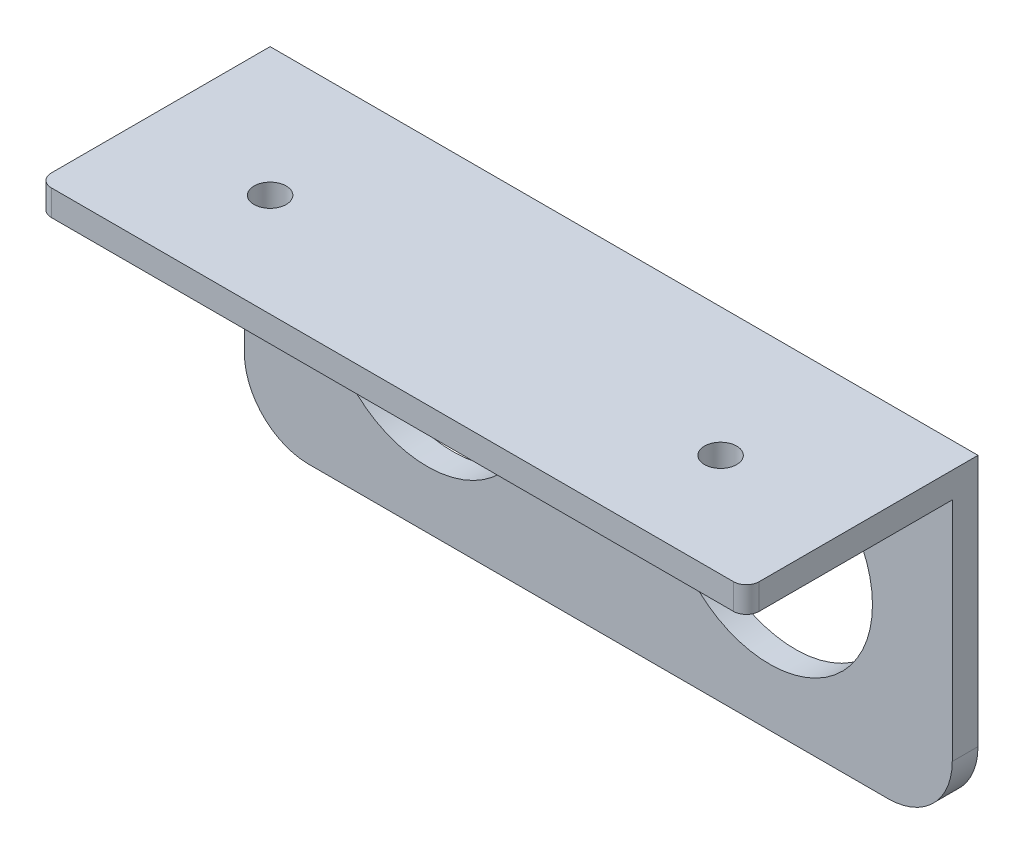
ISO-10303-21;
HEADER;
FILE_DESCRIPTION(('STEP AP214'),'2;1');
FILE_NAME('part.step','',(''),(''),'','','');
FILE_SCHEMA(('AUTOMOTIVE_DESIGN { 1 0 10303 214 1 1 1 1 }'));
ENDSEC;
DATA;
#1=APPLICATION_CONTEXT('core data for automotive mechanical design processes');
#2=APPLICATION_PROTOCOL_DEFINITION('international standard','automotive_design',2000,#1);
#3=PRODUCT_CONTEXT('',#1,'mechanical');
#4=PRODUCT('Part','Part','',(#3));
#5=PRODUCT_RELATED_PRODUCT_CATEGORY('part','',(#4));
#6=PRODUCT_DEFINITION_FORMATION('','',#4);
#7=PRODUCT_DEFINITION_CONTEXT('part definition',#1,'design');
#8=PRODUCT_DEFINITION('design','',#6,#7);
#9=PRODUCT_DEFINITION_SHAPE('','',#8);
#10=(LENGTH_UNIT() NAMED_UNIT(*) SI_UNIT(.MILLI.,.METRE.));
#11=(NAMED_UNIT(*) PLANE_ANGLE_UNIT() SI_UNIT($,.RADIAN.));
#12=(NAMED_UNIT(*) SI_UNIT($,.STERADIAN.) SOLID_ANGLE_UNIT());
#13=UNCERTAINTY_MEASURE_WITH_UNIT(LENGTH_MEASURE(1.E-05),#10,'distance_accuracy_value','');
#14=(GEOMETRIC_REPRESENTATION_CONTEXT(3) GLOBAL_UNCERTAINTY_ASSIGNED_CONTEXT((#13)) GLOBAL_UNIT_ASSIGNED_CONTEXT((#10,
#11,#12)) REPRESENTATION_CONTEXT('',''));
#15=CARTESIAN_POINT('',(0.,0.,0.));
#16=DIRECTION('',(0.,0.,1.));
#17=DIRECTION('',(1.,0.,0.));
#18=AXIS2_PLACEMENT_3D('',#15,#16,#17);
#19=CARTESIAN_POINT('',(21.4280575539568,6.06816546762589,2.));
#20=DIRECTION('',(0.,0.,-1.));
#21=DIRECTION('',(-1.,0.,0.));
#22=AXIS2_PLACEMENT_3D('',#19,#20,#21);
#23=CYLINDRICAL_SURFACE('',#22,5.);
#24=DIRECTION('',(0.,0.,1.));
#25=VECTOR('',#24,1.);
#26=CARTESIAN_POINT('',(21.4280575539568,1.06816546762589,2.));
#27=LINE('',#26,#25);
#28=CARTESIAN_POINT('',(21.4280575539568,1.06816546762589,0.));
#29=VERTEX_POINT('',#28);
#30=CARTESIAN_POINT('',(21.4280575539568,1.06816546762589,2.));
#31=VERTEX_POINT('',#30);
#32=EDGE_CURVE('E295',#29,#31,#27,.T.);
#33=ORIENTED_EDGE('',*,*,#32,.F.);
#34=CARTESIAN_POINT('',(21.4280575539568,6.06816546762589,0.));
#35=DIRECTION('',(0.,0.,1.));
#36=DIRECTION('',(1.,0.,0.));
#37=AXIS2_PLACEMENT_3D('',#34,#35,#36);
#38=CIRCLE('',#37,5.);
#39=CARTESIAN_POINT('',(26.4280575539568,6.06816546762589,0.));
#40=VERTEX_POINT('',#39);
#41=EDGE_CURVE('E301',#40,#29,#38,.F.);
#42=ORIENTED_EDGE('',*,*,#41,.F.);
#43=DIRECTION('',(0.,0.,1.));
#44=VECTOR('',#43,1.);
#45=CARTESIAN_POINT('',(26.4280575539568,6.06816546762589,2.));
#46=LINE('',#45,#44);
#47=CARTESIAN_POINT('',(26.4280575539568,6.06816546762589,2.));
#48=VERTEX_POINT('',#47);
#49=EDGE_CURVE('E185',#48,#40,#46,.F.);
#50=ORIENTED_EDGE('',*,*,#49,.F.);
#51=CARTESIAN_POINT('',(21.4280575539568,6.06816546762589,2.));
#52=DIRECTION('',(0.,0.,1.));
#53=DIRECTION('',(1.,0.,0.));
#54=AXIS2_PLACEMENT_3D('',#51,#52,#53);
#55=CIRCLE('',#54,5.);
#56=EDGE_CURVE('E304',#31,#48,#55,.T.);
#57=ORIENTED_EDGE('',*,*,#56,.F.);
#58=EDGE_LOOP('',(#33,#42,#50,#57));
#59=FACE_BOUND('',#58,.T.);
#60=ADVANCED_FACE('F51',(#59),#23,.T.);
#61=CARTESIAN_POINT('',(-23.5719424460432,6.06816546762589,2.));
#62=DIRECTION('',(0.,0.,-1.));
#63=DIRECTION('',(-1.,0.,0.));
#64=AXIS2_PLACEMENT_3D('',#61,#62,#63);
#65=CYLINDRICAL_SURFACE('',#64,5.);
#66=DIRECTION('',(0.,0.,-1.));
#67=VECTOR('',#66,1.);
#68=CARTESIAN_POINT('',(-23.5719424460432,1.06816546762589,2.));
#69=LINE('',#68,#67);
#70=CARTESIAN_POINT('',(-23.5719424460432,1.06816546762589,2.));
#71=VERTEX_POINT('',#70);
#72=CARTESIAN_POINT('',(-23.5719424460432,1.06816546762589,0.));
#73=VERTEX_POINT('',#72);
#74=EDGE_CURVE('E276',#71,#73,#69,.T.);
#75=ORIENTED_EDGE('',*,*,#74,.F.);
#76=CARTESIAN_POINT('',(-23.5719424460432,6.06816546762589,2.));
#77=DIRECTION('',(0.,0.,1.));
#78=DIRECTION('',(1.,0.,0.));
#79=AXIS2_PLACEMENT_3D('',#76,#77,#78);
#80=CIRCLE('',#79,5.);
#81=CARTESIAN_POINT('',(-28.5719424460432,6.06816546762589,2.));
#82=VERTEX_POINT('',#81);
#83=EDGE_CURVE('E289',#82,#71,#80,.T.);
#84=ORIENTED_EDGE('',*,*,#83,.F.);
#85=DIRECTION('',(0.,0.,-1.));
#86=VECTOR('',#85,1.);
#87=CARTESIAN_POINT('',(-28.5719424460432,6.06816546762589,2.));
#88=LINE('',#87,#86);
#89=CARTESIAN_POINT('',(-28.5719424460432,6.06816546762589,0.));
#90=VERTEX_POINT('',#89);
#91=EDGE_CURVE('E285',#90,#82,#88,.F.);
#92=ORIENTED_EDGE('',*,*,#91,.F.);
#93=CARTESIAN_POINT('',(-23.5719424460432,6.06816546762589,0.));
#94=DIRECTION('',(0.,0.,1.));
#95=DIRECTION('',(1.,0.,0.));
#96=AXIS2_PLACEMENT_3D('',#93,#94,#95);
#97=CIRCLE('',#96,5.);
#98=EDGE_CURVE('E292',#73,#90,#97,.F.);
#99=ORIENTED_EDGE('',*,*,#98,.F.);
#100=EDGE_LOOP('',(#75,#84,#92,#99));
#101=FACE_BOUND('',#100,.T.);
#102=ADVANCED_FACE('F398',(#101),#65,.T.);
#103=CARTESIAN_POINT('',(-28.5719424460432,23.6681654676259,2.));
#104=DIRECTION('',(1.,0.,0.));
#105=DIRECTION('',(0.,1.,0.));
#106=AXIS2_PLACEMENT_3D('',#103,#104,#105);
#107=PLANE('',#106);
#108=DIRECTION('',(0.,0.,-1.));
#109=VECTOR('',#108,1.);
#110=CARTESIAN_POINT('',(-28.5719424460432,23.6681654676259,18.));
#111=LINE('',#110,#109);
#112=CARTESIAN_POINT('',(-28.5719424460432,23.6681654676259,17.));
#113=VERTEX_POINT('',#112);
#114=CARTESIAN_POINT('',(-28.5719424460432,23.6681654676259,2.));
#115=VERTEX_POINT('',#114);
#116=EDGE_CURVE('E213',#113,#115,#111,.T.);
#117=ORIENTED_EDGE('',*,*,#116,.F.);
#118=DIRECTION('',(0.,-1.,0.));
#119=VECTOR('',#118,1.);
#120=CARTESIAN_POINT('',(-28.5719424460432,25.6681654676259,17.));
#121=LINE('',#120,#119);
#122=CARTESIAN_POINT('',(-28.5719424460432,25.6681654676259,17.));
#123=VERTEX_POINT('',#122);
#124=EDGE_CURVE('E11',#113,#123,#121,.F.);
#125=ORIENTED_EDGE('',*,*,#124,.T.);
#126=DIRECTION('',(0.,0.,-1.));
#127=VECTOR('',#126,1.);
#128=CARTESIAN_POINT('',(-28.5719424460432,25.6681654676259,18.));
#129=LINE('',#128,#127);
#130=CARTESIAN_POINT('',(-28.5719424460432,25.6681654676259,0.));
#131=VERTEX_POINT('',#130);
#132=EDGE_CURVE('E177',#123,#131,#129,.T.);
#133=ORIENTED_EDGE('',*,*,#132,.T.);
#134=DIRECTION('',(0.,-1.,0.));
#135=VECTOR('',#134,1.);
#136=CARTESIAN_POINT('',(-28.5719424460432,23.6681654676259,0.));
#137=LINE('',#136,#135);
#138=EDGE_CURVE('E195',#131,#90,#137,.T.);
#139=ORIENTED_EDGE('',*,*,#138,.T.);
#140=ORIENTED_EDGE('',*,*,#91,.T.);
#141=DIRECTION('',(0.,-1.,0.));
#142=VECTOR('',#141,1.);
#143=CARTESIAN_POINT('',(-28.5719424460432,23.6681654676259,2.));
#144=LINE('',#143,#142);
#145=EDGE_CURVE('E188',#115,#82,#144,.T.);
#146=ORIENTED_EDGE('',*,*,#145,.F.);
#147=EDGE_LOOP('',(#117,#125,#133,#139,#140,#146));
#148=FACE_BOUND('',#147,.T.);
#149=ADVANCED_FACE('F400',(#148),#107,.F.);
#150=CARTESIAN_POINT('',(-28.5719424460432,1.06816546762589,2.));
#151=DIRECTION('',(0.,1.,0.));
#152=DIRECTION('',(0.,0.,1.));
#153=AXIS2_PLACEMENT_3D('',#150,#151,#152);
#154=PLANE('',#153);
#155=DIRECTION('',(1.,0.,0.));
#156=VECTOR('',#155,1.);
#157=CARTESIAN_POINT('',(-28.5719424460432,1.06816546762589,0.));
#158=LINE('',#157,#156);
#159=EDGE_CURVE('E189',#73,#29,#158,.T.);
#160=ORIENTED_EDGE('',*,*,#159,.T.);
#161=ORIENTED_EDGE('',*,*,#32,.T.);
#162=DIRECTION('',(1.,0.,0.));
#163=VECTOR('',#162,1.);
#164=CARTESIAN_POINT('',(-28.5719424460432,1.06816546762589,2.));
#165=LINE('',#164,#163);
#166=EDGE_CURVE('E265',#71,#31,#165,.T.);
#167=ORIENTED_EDGE('',*,*,#166,.F.);
#168=ORIENTED_EDGE('',*,*,#74,.T.);
#169=EDGE_LOOP('',(#160,#161,#167,#168));
#170=FACE_BOUND('',#169,.T.);
#171=ADVANCED_FACE('F395',(#170),#154,.F.);
#172=CARTESIAN_POINT('',(26.4280575539568,23.6681654676259,2.));
#173=DIRECTION('',(1.,0.,0.));
#174=DIRECTION('',(0.,1.,0.));
#175=AXIS2_PLACEMENT_3D('',#172,#173,#174);
#176=PLANE('',#175);
#177=DIRECTION('',(0.,0.,-1.));
#178=VECTOR('',#177,1.);
#179=CARTESIAN_POINT('',(26.4280575539568,25.6681654676259,18.));
#180=LINE('',#179,#178);
#181=CARTESIAN_POINT('',(26.4280575539568,25.6681654676259,17.));
#182=VERTEX_POINT('',#181);
#183=CARTESIAN_POINT('',(26.4280575539568,25.6681654676259,0.));
#184=VERTEX_POINT('',#183);
#185=EDGE_CURVE('E166',#182,#184,#180,.T.);
#186=ORIENTED_EDGE('',*,*,#185,.F.);
#187=DIRECTION('',(0.,-1.,0.));
#188=VECTOR('',#187,1.);
#189=CARTESIAN_POINT('',(26.4280575539568,23.6681654676259,17.));
#190=LINE('',#189,#188);
#191=CARTESIAN_POINT('',(26.4280575539568,23.6681654676259,17.));
#192=VERTEX_POINT('',#191);
#193=EDGE_CURVE('E335',#182,#192,#190,.T.);
#194=ORIENTED_EDGE('',*,*,#193,.T.);
#195=DIRECTION('',(0.,0.,-1.));
#196=VECTOR('',#195,1.);
#197=CARTESIAN_POINT('',(26.4280575539568,23.6681654676259,18.));
#198=LINE('',#197,#196);
#199=CARTESIAN_POINT('',(26.4280575539568,23.6681654676259,2.));
#200=VERTEX_POINT('',#199);
#201=EDGE_CURVE('E176',#192,#200,#198,.T.);
#202=ORIENTED_EDGE('',*,*,#201,.T.);
#203=DIRECTION('',(0.,-1.,0.));
#204=VECTOR('',#203,1.);
#205=CARTESIAN_POINT('',(26.4280575539568,23.6681654676259,2.));
#206=LINE('',#205,#204);
#207=EDGE_CURVE('E269',#200,#48,#206,.T.);
#208=ORIENTED_EDGE('',*,*,#207,.T.);
#209=ORIENTED_EDGE('',*,*,#49,.T.);
#210=DIRECTION('',(0.,-1.,0.));
#211=VECTOR('',#210,1.);
#212=CARTESIAN_POINT('',(26.4280575539568,23.6681654676259,0.));
#213=LINE('',#212,#211);
#214=EDGE_CURVE('E181',#184,#40,#213,.T.);
#215=ORIENTED_EDGE('',*,*,#214,.F.);
#216=EDGE_LOOP('',(#186,#194,#202,#208,#209,#215));
#217=FACE_BOUND('',#216,.T.);
#218=ADVANCED_FACE('F182',(#217),#176,.T.);
#219=CARTESIAN_POINT('',(0.,0.,2.));
#220=DIRECTION('',(0.,0.,1.));
#221=DIRECTION('',(1.,0.,0.));
#222=AXIS2_PLACEMENT_3D('',#219,#220,#221);
#223=PLANE('',#222);
#224=ORIENTED_EDGE('',*,*,#166,.T.);
#225=ORIENTED_EDGE('',*,*,#56,.T.);
#226=ORIENTED_EDGE('',*,*,#207,.F.);
#227=DIRECTION('',(1.,0.,0.));
#228=VECTOR('',#227,1.);
#229=CARTESIAN_POINT('',(-28.5719424460432,23.6681654676259,2.));
#230=LINE('',#229,#228);
#231=CARTESIAN_POINT('',(3.82805755395682,23.6681654676259,2.));
#232=VERTEX_POINT('',#231);
#233=EDGE_CURVE('E272',#232,#200,#230,.T.);
#234=ORIENTED_EDGE('',*,*,#233,.F.);
#235=DIRECTION('',(0.,-1.,0.));
#236=VECTOR('',#235,1.);
#237=CARTESIAN_POINT('',(3.82805755395682,23.6681654676259,2.));
#238=LINE('',#237,#236);
#239=CARTESIAN_POINT('',(3.82805755395682,20.7681654676259,2.));
#240=VERTEX_POINT('',#239);
#241=EDGE_CURVE('E222',#232,#240,#238,.T.);
#242=ORIENTED_EDGE('',*,*,#241,.T.);
#243=CARTESIAN_POINT('',(2.02805755395682,20.7681654676259,2.));
#244=DIRECTION('',(0.,0.,1.));
#245=DIRECTION('',(1.,0.,0.));
#246=AXIS2_PLACEMENT_3D('',#243,#244,#245);
#247=CIRCLE('',#246,1.8);
#248=CARTESIAN_POINT('',(2.02805755395682,18.9681654676259,2.));
#249=VERTEX_POINT('',#248);
#250=EDGE_CURVE('E315',#240,#249,#247,.F.);
#251=ORIENTED_EDGE('',*,*,#250,.T.);
#252=DIRECTION('',(1.,0.,0.));
#253=VECTOR('',#252,1.);
#254=CARTESIAN_POINT('',(-6.17194244604318,18.9681654676259,2.));
#255=LINE('',#254,#253);
#256=CARTESIAN_POINT('',(-4.37194244604318,18.9681654676259,2.));
#257=VERTEX_POINT('',#256);
#258=EDGE_CURVE('E233',#257,#249,#255,.T.);
#259=ORIENTED_EDGE('',*,*,#258,.F.);
#260=CARTESIAN_POINT('',(-4.37194244604318,20.7681654676259,2.));
#261=DIRECTION('',(0.,0.,1.));
#262=DIRECTION('',(1.,0.,0.));
#263=AXIS2_PLACEMENT_3D('',#260,#261,#262);
#264=CIRCLE('',#263,1.8);
#265=CARTESIAN_POINT('',(-6.17194244604318,20.7681654676259,2.));
#266=VERTEX_POINT('',#265);
#267=EDGE_CURVE('E329',#257,#266,#264,.F.);
#268=ORIENTED_EDGE('',*,*,#267,.T.);
#269=DIRECTION('',(0.,-1.,0.));
#270=VECTOR('',#269,1.);
#271=CARTESIAN_POINT('',(-6.17194244604318,23.6681654676259,2.));
#272=LINE('',#271,#270);
#273=CARTESIAN_POINT('',(-6.17194244604318,23.6681654676259,2.));
#274=VERTEX_POINT('',#273);
#275=EDGE_CURVE('E216',#274,#266,#272,.T.);
#276=ORIENTED_EDGE('',*,*,#275,.F.);
#277=EDGE_CURVE('E273',#115,#274,#230,.T.);
#278=ORIENTED_EDGE('',*,*,#277,.F.);
#279=ORIENTED_EDGE('',*,*,#145,.T.);
#280=ORIENTED_EDGE('',*,*,#83,.T.);
#281=EDGE_LOOP('',(#224,#225,#226,#234,#242,#251,#259,#268,#276,#278,#279,#280));
#282=FACE_BOUND('',#281,.T.);
#283=CARTESIAN_POINT('',(12.2280575539568,13.5181654676259,2.));
#284=DIRECTION('',(0.,0.,1.));
#285=DIRECTION('',(1.,0.,0.));
#286=AXIS2_PLACEMENT_3D('',#283,#284,#285);
#287=CIRCLE('',#286,8.);
#288=CARTESIAN_POINT('',(20.2280575539568,13.5181654676259,2.));
#289=VERTEX_POINT('',#288);
#290=EDGE_CURVE('E243',#289,#289,#287,.T.);
#291=ORIENTED_EDGE('',*,*,#290,.F.);
#292=EDGE_LOOP('',(#291));
#293=FACE_BOUND('',#292,.T.);
#294=CARTESIAN_POINT('',(-14.3719424460432,13.5181654676259,2.));
#295=DIRECTION('',(0.,0.,1.));
#296=DIRECTION('',(1.,0.,0.));
#297=AXIS2_PLACEMENT_3D('',#294,#295,#296);
#298=CIRCLE('',#297,8.);
#299=CARTESIAN_POINT('',(-6.37194244604318,13.5181654676259,2.));
#300=VERTEX_POINT('',#299);
#301=EDGE_CURVE('E251',#300,#300,#298,.T.);
#302=ORIENTED_EDGE('',*,*,#301,.F.);
#303=EDGE_LOOP('',(#302));
#304=FACE_BOUND('',#303,.T.);
#305=ADVANCED_FACE('F386',(#282,#293,#304),#223,.T.);
#306=CARTESIAN_POINT('',(0.,0.,0.));
#307=DIRECTION('',(0.,0.,1.));
#308=DIRECTION('',(1.,0.,0.));
#309=AXIS2_PLACEMENT_3D('',#306,#307,#308);
#310=PLANE('',#309);
#311=ORIENTED_EDGE('',*,*,#214,.T.);
#312=ORIENTED_EDGE('',*,*,#41,.T.);
#313=ORIENTED_EDGE('',*,*,#159,.F.);
#314=ORIENTED_EDGE('',*,*,#98,.T.);
#315=ORIENTED_EDGE('',*,*,#138,.F.);
#316=DIRECTION('',(1.,0.,0.));
#317=VECTOR('',#316,1.);
#318=CARTESIAN_POINT('',(-28.5719424460432,25.6681654676259,0.));
#319=LINE('',#318,#317);
#320=EDGE_CURVE('E170',#131,#184,#319,.T.);
#321=ORIENTED_EDGE('',*,*,#320,.T.);
#322=EDGE_LOOP('',(#311,#312,#313,#314,#315,#321));
#323=FACE_BOUND('',#322,.T.);
#324=CARTESIAN_POINT('',(12.2280575539568,13.5181654676259,0.));
#325=DIRECTION('',(0.,0.,1.));
#326=DIRECTION('',(1.,0.,0.));
#327=AXIS2_PLACEMENT_3D('',#324,#325,#326);
#328=CIRCLE('',#327,8.);
#329=CARTESIAN_POINT('',(20.2280575539568,13.5181654676259,0.));
#330=VERTEX_POINT('',#329);
#331=EDGE_CURVE('E247',#330,#330,#328,.T.);
#332=ORIENTED_EDGE('',*,*,#331,.T.);
#333=EDGE_LOOP('',(#332));
#334=FACE_BOUND('',#333,.T.);
#335=CARTESIAN_POINT('',(-14.3719424460432,13.5181654676259,0.));
#336=DIRECTION('',(0.,0.,1.));
#337=DIRECTION('',(1.,0.,0.));
#338=AXIS2_PLACEMENT_3D('',#335,#336,#337);
#339=CIRCLE('',#338,8.);
#340=CARTESIAN_POINT('',(-6.37194244604318,13.5181654676259,0.));
#341=VERTEX_POINT('',#340);
#342=EDGE_CURVE('E255',#341,#341,#339,.T.);
#343=ORIENTED_EDGE('',*,*,#342,.T.);
#344=EDGE_LOOP('',(#343));
#345=FACE_BOUND('',#344,.T.);
#346=DIRECTION('',(0.,-1.,0.));
#347=VECTOR('',#346,1.);
#348=CARTESIAN_POINT('',(3.82805755395682,23.6681654676259,0.));
#349=LINE('',#348,#347);
#350=CARTESIAN_POINT('',(3.82805755395682,23.6681654676259,0.));
#351=VERTEX_POINT('',#350);
#352=CARTESIAN_POINT('',(3.82805755395682,20.7681654676259,0.));
#353=VERTEX_POINT('',#352);
#354=EDGE_CURVE('E225',#351,#353,#349,.T.);
#355=ORIENTED_EDGE('',*,*,#354,.F.);
#356=DIRECTION('',(1.,0.,0.));
#357=VECTOR('',#356,1.);
#358=CARTESIAN_POINT('',(-28.5719424460432,23.6681654676259,0.));
#359=LINE('',#358,#357);
#360=CARTESIAN_POINT('',(-6.17194244604318,23.6681654676259,0.));
#361=VERTEX_POINT('',#360);
#362=EDGE_CURVE('E198',#361,#351,#359,.T.);
#363=ORIENTED_EDGE('',*,*,#362,.F.);
#364=DIRECTION('',(0.,-1.,0.));
#365=VECTOR('',#364,1.);
#366=CARTESIAN_POINT('',(-6.17194244604318,23.6681654676259,0.));
#367=LINE('',#366,#365);
#368=CARTESIAN_POINT('',(-6.17194244604318,20.7681654676259,0.));
#369=VERTEX_POINT('',#368);
#370=EDGE_CURVE('E217',#361,#369,#367,.T.);
#371=ORIENTED_EDGE('',*,*,#370,.T.);
#372=CARTESIAN_POINT('',(-4.37194244604318,20.7681654676259,0.));
#373=DIRECTION('',(0.,0.,1.));
#374=DIRECTION('',(1.,0.,0.));
#375=AXIS2_PLACEMENT_3D('',#372,#373,#374);
#376=CIRCLE('',#375,1.8);
#377=CARTESIAN_POINT('',(-4.37194244604318,18.9681654676259,0.));
#378=VERTEX_POINT('',#377);
#379=EDGE_CURVE('E332',#369,#378,#376,.T.);
#380=ORIENTED_EDGE('',*,*,#379,.T.);
#381=DIRECTION('',(1.,0.,0.));
#382=VECTOR('',#381,1.);
#383=CARTESIAN_POINT('',(-6.17194244604318,18.9681654676259,0.));
#384=LINE('',#383,#382);
#385=CARTESIAN_POINT('',(2.02805755395682,18.9681654676259,0.));
#386=VERTEX_POINT('',#385);
#387=EDGE_CURVE('E221',#378,#386,#384,.T.);
#388=ORIENTED_EDGE('',*,*,#387,.T.);
#389=CARTESIAN_POINT('',(2.02805755395682,20.7681654676259,0.));
#390=DIRECTION('',(0.,0.,1.));
#391=DIRECTION('',(1.,0.,0.));
#392=AXIS2_PLACEMENT_3D('',#389,#390,#391);
#393=CIRCLE('',#392,1.8);
#394=EDGE_CURVE('E319',#386,#353,#393,.T.);
#395=ORIENTED_EDGE('',*,*,#394,.T.);
#396=EDGE_LOOP('',(#355,#363,#371,#380,#388,#395));
#397=FACE_BOUND('',#396,.T.);
#398=ADVANCED_FACE('F192',(#323,#334,#345,#397),#310,.F.);
#399=CARTESIAN_POINT('',(-14.3719424460432,13.5181654676259,0.));
#400=DIRECTION('',(0.,0.,1.));
#401=DIRECTION('',(1.,0.,0.));
#402=AXIS2_PLACEMENT_3D('',#399,#400,#401);
#403=CYLINDRICAL_SURFACE('',#402,8.);
#404=ORIENTED_EDGE('',*,*,#342,.F.);
#405=EDGE_LOOP('',(#404));
#406=FACE_BOUND('',#405,.T.);
#407=ORIENTED_EDGE('',*,*,#301,.T.);
#408=EDGE_LOOP('',(#407));
#409=FACE_BOUND('',#408,.T.);
#410=ADVANCED_FACE('F546',(#406,#409),#403,.F.);
#411=CARTESIAN_POINT('',(12.2280575539568,13.5181654676259,0.));
#412=DIRECTION('',(0.,0.,1.));
#413=DIRECTION('',(1.,0.,0.));
#414=AXIS2_PLACEMENT_3D('',#411,#412,#413);
#415=CYLINDRICAL_SURFACE('',#414,8.);
#416=ORIENTED_EDGE('',*,*,#331,.F.);
#417=EDGE_LOOP('',(#416));
#418=FACE_BOUND('',#417,.T.);
#419=ORIENTED_EDGE('',*,*,#290,.T.);
#420=EDGE_LOOP('',(#419));
#421=FACE_BOUND('',#420,.T.);
#422=ADVANCED_FACE('F437',(#418,#421),#415,.F.);
#423=CARTESIAN_POINT('',(-6.17194244604318,23.6681654676259,0.));
#424=DIRECTION('',(-1.,0.,0.));
#425=DIRECTION('',(0.,-1.,0.));
#426=AXIS2_PLACEMENT_3D('',#423,#424,#425);
#427=PLANE('',#426);
#428=ORIENTED_EDGE('',*,*,#275,.T.);
#429=DIRECTION('',(0.,0.,1.));
#430=VECTOR('',#429,1.);
#431=CARTESIAN_POINT('',(-6.17194244604318,20.7681654676259,0.));
#432=LINE('',#431,#430);
#433=EDGE_CURVE('E326',#266,#369,#432,.F.);
#434=ORIENTED_EDGE('',*,*,#433,.T.);
#435=ORIENTED_EDGE('',*,*,#370,.F.);
#436=DIRECTION('',(0.,0.,1.));
#437=VECTOR('',#436,1.);
#438=CARTESIAN_POINT('',(-6.17194244604318,23.6681654676259,0.));
#439=LINE('',#438,#437);
#440=EDGE_CURVE('E239',#361,#274,#439,.T.);
#441=ORIENTED_EDGE('',*,*,#440,.T.);
#442=EDGE_LOOP('',(#428,#434,#435,#441));
#443=FACE_BOUND('',#442,.T.);
#444=ADVANCED_FACE('F410',(#443),#427,.F.);
#445=CARTESIAN_POINT('',(3.82805755395682,23.6681654676259,0.));
#446=DIRECTION('',(-1.,0.,0.));
#447=DIRECTION('',(0.,-1.,0.));
#448=AXIS2_PLACEMENT_3D('',#445,#446,#447);
#449=PLANE('',#448);
#450=ORIENTED_EDGE('',*,*,#354,.T.);
#451=DIRECTION('',(0.,0.,1.));
#452=VECTOR('',#451,1.);
#453=CARTESIAN_POINT('',(3.82805755395682,20.7681654676259,0.));
#454=LINE('',#453,#452);
#455=EDGE_CURVE('E307',#353,#240,#454,.T.);
#456=ORIENTED_EDGE('',*,*,#455,.T.);
#457=ORIENTED_EDGE('',*,*,#241,.F.);
#458=DIRECTION('',(0.,0.,1.));
#459=VECTOR('',#458,1.);
#460=CARTESIAN_POINT('',(3.82805755395682,23.6681654676259,0.));
#461=LINE('',#460,#459);
#462=EDGE_CURVE('E229',#351,#232,#461,.T.);
#463=ORIENTED_EDGE('',*,*,#462,.F.);
#464=EDGE_LOOP('',(#450,#456,#457,#463));
#465=FACE_BOUND('',#464,.T.);
#466=ADVANCED_FACE('F427',(#465),#449,.T.);
#467=CARTESIAN_POINT('',(-6.17194244604318,18.9681654676259,0.));
#468=DIRECTION('',(0.,-1.,0.));
#469=DIRECTION('',(0.,0.,-1.));
#470=AXIS2_PLACEMENT_3D('',#467,#468,#469);
#471=PLANE('',#470);
#472=ORIENTED_EDGE('',*,*,#387,.F.);
#473=DIRECTION('',(0.,0.,1.));
#474=VECTOR('',#473,1.);
#475=CARTESIAN_POINT('',(-4.37194244604318,18.9681654676259,2.));
#476=LINE('',#475,#474);
#477=EDGE_CURVE('E322',#378,#257,#476,.T.);
#478=ORIENTED_EDGE('',*,*,#477,.T.);
#479=ORIENTED_EDGE('',*,*,#258,.T.);
#480=DIRECTION('',(0.,0.,1.));
#481=VECTOR('',#480,1.);
#482=CARTESIAN_POINT('',(2.02805755395682,18.9681654676259,0.));
#483=LINE('',#482,#481);
#484=EDGE_CURVE('E311',#249,#386,#483,.F.);
#485=ORIENTED_EDGE('',*,*,#484,.T.);
#486=EDGE_LOOP('',(#472,#478,#479,#485));
#487=FACE_BOUND('',#486,.T.);
#488=ADVANCED_FACE('F378',(#487),#471,.F.);
#489=CARTESIAN_POINT('',(-28.5719424460432,23.6681654676259,18.));
#490=DIRECTION('',(0.,1.,0.));
#491=DIRECTION('',(-1.,0.,0.));
#492=AXIS2_PLACEMENT_3D('',#489,#490,#491);
#493=PLANE('',#492);
#494=CARTESIAN_POINT('',(-18.5719424460432,23.6681654676259,10.));
#495=DIRECTION('',(0.,-1.,0.));
#496=DIRECTION('',(0.,0.,-1.));
#497=AXIS2_PLACEMENT_3D('',#494,#495,#496);
#498=CIRCLE('',#497,1.24999999999999);
#499=CARTESIAN_POINT('',(-18.5719424460432,23.6681654676259,8.75000000000001));
#500=VERTEX_POINT('',#499);
#501=EDGE_CURVE('E368',#500,#500,#498,.T.);
#502=ORIENTED_EDGE('',*,*,#501,.F.);
#503=EDGE_LOOP('',(#502));
#504=FACE_BOUND('',#503,.T.);
#505=CARTESIAN_POINT('',(16.4280575539568,23.6681654676259,10.));
#506=DIRECTION('',(0.,-1.,0.));
#507=DIRECTION('',(0.,0.,-1.));
#508=AXIS2_PLACEMENT_3D('',#505,#506,#507);
#509=CIRCLE('',#508,1.24999999999999);
#510=CARTESIAN_POINT('',(16.4280575539568,23.6681654676259,8.75000000000001));
#511=VERTEX_POINT('',#510);
#512=EDGE_CURVE('E360',#511,#511,#509,.T.);
#513=ORIENTED_EDGE('',*,*,#512,.F.);
#514=EDGE_LOOP('',(#513));
#515=FACE_BOUND('',#514,.T.);
#516=ORIENTED_EDGE('',*,*,#201,.F.);
#517=CARTESIAN_POINT('',(25.4280575539568,23.6681654676259,17.));
#518=DIRECTION('',(0.,1.,0.));
#519=DIRECTION('',(-1.,0.,0.));
#520=AXIS2_PLACEMENT_3D('',#517,#518,#519);
#521=CIRCLE('',#520,1.);
#522=CARTESIAN_POINT('',(25.4280575539568,23.6681654676259,18.));
#523=VERTEX_POINT('',#522);
#524=EDGE_CURVE('E341',#192,#523,#521,.F.);
#525=ORIENTED_EDGE('',*,*,#524,.T.);
#526=DIRECTION('',(1.,0.,0.));
#527=VECTOR('',#526,1.);
#528=CARTESIAN_POINT('',(-28.5719424460432,23.6681654676259,18.));
#529=LINE('',#528,#527);
#530=CARTESIAN_POINT('',(-27.5719424460432,23.6681654676259,18.));
#531=VERTEX_POINT('',#530);
#532=EDGE_CURVE('E197',#531,#523,#529,.T.);
#533=ORIENTED_EDGE('',*,*,#532,.F.);
#534=CARTESIAN_POINT('',(-27.5719424460432,23.6681654676259,17.));
#535=DIRECTION('',(0.,1.,0.));
#536=DIRECTION('',(-1.,0.,0.));
#537=AXIS2_PLACEMENT_3D('',#534,#535,#536);
#538=CIRCLE('',#537,1.);
#539=EDGE_CURVE('E338',#531,#113,#538,.F.);
#540=ORIENTED_EDGE('',*,*,#539,.T.);
#541=ORIENTED_EDGE('',*,*,#116,.T.);
#542=ORIENTED_EDGE('',*,*,#277,.T.);
#543=ORIENTED_EDGE('',*,*,#440,.F.);
#544=ORIENTED_EDGE('',*,*,#362,.T.);
#545=ORIENTED_EDGE('',*,*,#462,.T.);
#546=ORIENTED_EDGE('',*,*,#233,.T.);
#547=EDGE_LOOP('',(#516,#525,#533,#540,#541,#542,#543,#544,#545,#546));
#548=FACE_BOUND('',#547,.T.);
#549=ADVANCED_FACE('F375',(#504,#515,#548),#493,.F.);
#550=CARTESIAN_POINT('',(-28.5719424460432,25.6681654676259,18.));
#551=DIRECTION('',(0.,1.,0.));
#552=DIRECTION('',(-1.,0.,0.));
#553=AXIS2_PLACEMENT_3D('',#550,#551,#552);
#554=PLANE('',#553);
#555=CARTESIAN_POINT('',(-18.5719424460432,25.6681654676259,10.));
#556=DIRECTION('',(0.,-1.,0.));
#557=DIRECTION('',(0.,0.,-1.));
#558=AXIS2_PLACEMENT_3D('',#555,#556,#557);
#559=CIRCLE('',#558,1.25);
#560=CARTESIAN_POINT('',(-18.5719424460432,25.6681654676259,8.75));
#561=VERTEX_POINT('',#560);
#562=EDGE_CURVE('E364',#561,#561,#559,.T.);
#563=ORIENTED_EDGE('',*,*,#562,.T.);
#564=EDGE_LOOP('',(#563));
#565=FACE_BOUND('',#564,.T.);
#566=CARTESIAN_POINT('',(16.4280575539568,25.6681654676259,10.));
#567=DIRECTION('',(0.,-1.,0.));
#568=DIRECTION('',(0.,0.,-1.));
#569=AXIS2_PLACEMENT_3D('',#566,#567,#568);
#570=CIRCLE('',#569,1.25);
#571=CARTESIAN_POINT('',(16.4280575539568,25.6681654676259,8.75));
#572=VERTEX_POINT('',#571);
#573=EDGE_CURVE('E205',#572,#572,#570,.T.);
#574=ORIENTED_EDGE('',*,*,#573,.T.);
#575=EDGE_LOOP('',(#574));
#576=FACE_BOUND('',#575,.T.);
#577=DIRECTION('',(1.,0.,0.));
#578=VECTOR('',#577,1.);
#579=CARTESIAN_POINT('',(-28.5719424460432,25.6681654676259,18.));
#580=LINE('',#579,#578);
#581=CARTESIAN_POINT('',(-27.5719424460432,25.6681654676259,18.));
#582=VERTEX_POINT('',#581);
#583=CARTESIAN_POINT('',(25.4280575539568,25.6681654676259,18.));
#584=VERTEX_POINT('',#583);
#585=EDGE_CURVE('E202',#582,#584,#580,.T.);
#586=ORIENTED_EDGE('',*,*,#585,.T.);
#587=CARTESIAN_POINT('',(25.4280575539568,25.6681654676259,17.));
#588=DIRECTION('',(0.,1.,0.));
#589=DIRECTION('',(-1.,0.,0.));
#590=AXIS2_PLACEMENT_3D('',#587,#588,#589);
#591=CIRCLE('',#590,1.);
#592=EDGE_CURVE('E60',#584,#182,#591,.T.);
#593=ORIENTED_EDGE('',*,*,#592,.T.);
#594=ORIENTED_EDGE('',*,*,#185,.T.);
#595=ORIENTED_EDGE('',*,*,#320,.F.);
#596=ORIENTED_EDGE('',*,*,#132,.F.);
#597=CARTESIAN_POINT('',(-27.5719424460432,25.6681654676259,17.));
#598=DIRECTION('',(0.,1.,0.));
#599=DIRECTION('',(-1.,0.,0.));
#600=AXIS2_PLACEMENT_3D('',#597,#598,#599);
#601=CIRCLE('',#600,1.);
#602=EDGE_CURVE('E350',#123,#582,#601,.T.);
#603=ORIENTED_EDGE('',*,*,#602,.T.);
#604=EDGE_LOOP('',(#586,#593,#594,#595,#596,#603));
#605=FACE_BOUND('',#604,.T.);
#606=ADVANCED_FACE('F168',(#565,#576,#605),#554,.T.);
#607=CARTESIAN_POINT('',(0.,0.,18.));
#608=DIRECTION('',(0.,0.,1.));
#609=DIRECTION('',(1.,0.,0.));
#610=AXIS2_PLACEMENT_3D('',#607,#608,#609);
#611=PLANE('',#610);
#612=ORIENTED_EDGE('',*,*,#532,.T.);
#613=DIRECTION('',(0.,-1.,0.));
#614=VECTOR('',#613,1.);
#615=CARTESIAN_POINT('',(25.4280575539568,0.,18.));
#616=LINE('',#615,#614);
#617=EDGE_CURVE('E73',#523,#584,#616,.F.);
#618=ORIENTED_EDGE('',*,*,#617,.T.);
#619=ORIENTED_EDGE('',*,*,#585,.F.);
#620=DIRECTION('',(0.,-1.,0.));
#621=VECTOR('',#620,1.);
#622=CARTESIAN_POINT('',(-27.5719424460432,23.6681654676259,18.));
#623=LINE('',#622,#621);
#624=EDGE_CURVE('E344',#582,#531,#623,.T.);
#625=ORIENTED_EDGE('',*,*,#624,.T.);
#626=EDGE_LOOP('',(#612,#618,#619,#625));
#627=FACE_BOUND('',#626,.T.);
#628=ADVANCED_FACE('F404',(#627),#611,.T.);
#629=CARTESIAN_POINT('',(16.4280575539568,23.6681654676259,10.));
#630=DIRECTION('',(0.,-1.,0.));
#631=DIRECTION('',(0.,0.,-1.));
#632=AXIS2_PLACEMENT_3D('',#629,#630,#631);
#633=CYLINDRICAL_SURFACE('',#632,1.24999999999999);
#634=ORIENTED_EDGE('',*,*,#573,.F.);
#635=EDGE_LOOP('',(#634));
#636=FACE_BOUND('',#635,.T.);
#637=ORIENTED_EDGE('',*,*,#512,.T.);
#638=EDGE_LOOP('',(#637));
#639=FACE_BOUND('',#638,.T.);
#640=ADVANCED_FACE('F497',(#636,#639),#633,.F.);
#641=CARTESIAN_POINT('',(-18.5719424460432,23.6681654676259,10.));
#642=DIRECTION('',(0.,-1.,0.));
#643=DIRECTION('',(0.,0.,-1.));
#644=AXIS2_PLACEMENT_3D('',#641,#642,#643);
#645=CYLINDRICAL_SURFACE('',#644,1.24999999999999);
#646=ORIENTED_EDGE('',*,*,#562,.F.);
#647=EDGE_LOOP('',(#646));
#648=FACE_BOUND('',#647,.T.);
#649=ORIENTED_EDGE('',*,*,#501,.T.);
#650=EDGE_LOOP('',(#649));
#651=FACE_BOUND('',#650,.T.);
#652=ADVANCED_FACE('F373',(#648,#651),#645,.F.);
#653=CARTESIAN_POINT('',(2.02805755395682,20.7681654676259,0.));
#654=DIRECTION('',(0.,0.,1.));
#655=DIRECTION('',(1.,0.,0.));
#656=AXIS2_PLACEMENT_3D('',#653,#654,#655);
#657=CYLINDRICAL_SURFACE('',#656,1.8);
#658=ORIENTED_EDGE('',*,*,#394,.F.);
#659=ORIENTED_EDGE('',*,*,#484,.F.);
#660=ORIENTED_EDGE('',*,*,#250,.F.);
#661=ORIENTED_EDGE('',*,*,#455,.F.);
#662=EDGE_LOOP('',(#658,#659,#660,#661));
#663=FACE_BOUND('',#662,.T.);
#664=ADVANCED_FACE('F425',(#663),#657,.F.);
#665=CARTESIAN_POINT('',(-4.37194244604318,20.7681654676259,0.));
#666=DIRECTION('',(0.,0.,-1.));
#667=DIRECTION('',(-1.,0.,0.));
#668=AXIS2_PLACEMENT_3D('',#665,#666,#667);
#669=CYLINDRICAL_SURFACE('',#668,1.8);
#670=ORIENTED_EDGE('',*,*,#379,.F.);
#671=ORIENTED_EDGE('',*,*,#433,.F.);
#672=ORIENTED_EDGE('',*,*,#267,.F.);
#673=ORIENTED_EDGE('',*,*,#477,.F.);
#674=EDGE_LOOP('',(#670,#671,#672,#673));
#675=FACE_BOUND('',#674,.T.);
#676=ADVANCED_FACE('F418',(#675),#669,.F.);
#677=CARTESIAN_POINT('',(25.4280575539568,23.6681654676259,17.));
#678=DIRECTION('',(0.,-1.,0.));
#679=DIRECTION('',(1.,0.,0.));
#680=AXIS2_PLACEMENT_3D('',#677,#678,#679);
#681=CYLINDRICAL_SURFACE('',#680,1.);
#682=ORIENTED_EDGE('',*,*,#592,.F.);
#683=ORIENTED_EDGE('',*,*,#617,.F.);
#684=ORIENTED_EDGE('',*,*,#524,.F.);
#685=ORIENTED_EDGE('',*,*,#193,.F.);
#686=EDGE_LOOP('',(#682,#683,#684,#685));
#687=FACE_BOUND('',#686,.T.);
#688=ADVANCED_FACE('F449',(#687),#681,.T.);
#689=CARTESIAN_POINT('',(-27.5719424460432,0.,17.));
#690=DIRECTION('',(0.,1.,0.));
#691=DIRECTION('',(-1.,0.,0.));
#692=AXIS2_PLACEMENT_3D('',#689,#690,#691);
#693=CYLINDRICAL_SURFACE('',#692,1.);
#694=ORIENTED_EDGE('',*,*,#602,.F.);
#695=ORIENTED_EDGE('',*,*,#124,.F.);
#696=ORIENTED_EDGE('',*,*,#539,.F.);
#697=ORIENTED_EDGE('',*,*,#624,.F.);
#698=EDGE_LOOP('',(#694,#695,#696,#697));
#699=FACE_BOUND('',#698,.T.);
#700=ADVANCED_FACE('F53',(#699),#693,.T.);
#701=CLOSED_SHELL('',(#60,#102,#149,#171,#218,#305,#398,#410,#422,#444,#466,#488,#549,#606,#628,
#640,#652,#664,#676,#688,#700));
#702=MANIFOLD_SOLID_BREP('B2',#701);
#703=ADVANCED_BREP_SHAPE_REPRESENTATION('',(#18,#702),#14);
#704=SHAPE_DEFINITION_REPRESENTATION(#9,#703);
ENDSEC;
END-ISO-10303-21;
